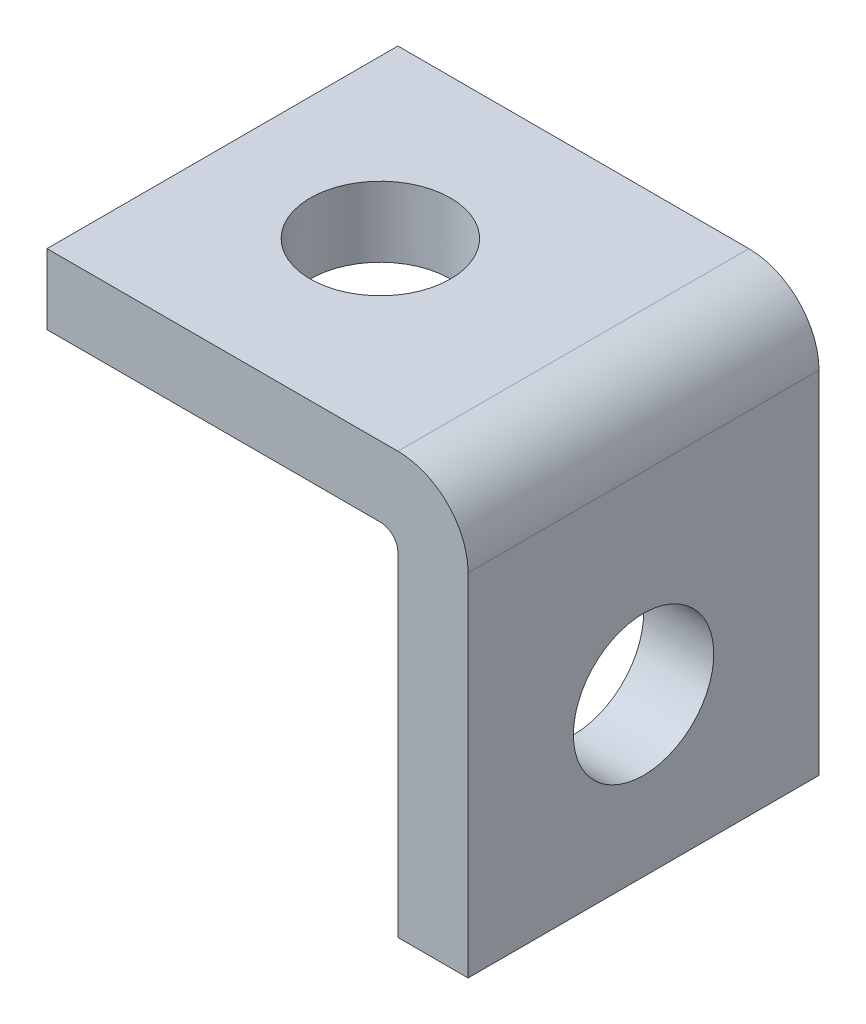
ISO-10303-21;
HEADER;
FILE_DESCRIPTION(('STEP AP214'),'2;1');
FILE_NAME('part.step','',(''),(''),'','','');
FILE_SCHEMA(('AUTOMOTIVE_DESIGN { 1 0 10303 214 1 1 1 1 }'));
ENDSEC;
DATA;
#1=APPLICATION_CONTEXT('core data for automotive mechanical design processes');
#2=APPLICATION_PROTOCOL_DEFINITION('international standard','automotive_design',2000,#1);
#3=PRODUCT_CONTEXT('',#1,'mechanical');
#4=PRODUCT('Part','Part','',(#3));
#5=PRODUCT_RELATED_PRODUCT_CATEGORY('part','',(#4));
#6=PRODUCT_DEFINITION_FORMATION('','',#4);
#7=PRODUCT_DEFINITION_CONTEXT('part definition',#1,'design');
#8=PRODUCT_DEFINITION('design','',#6,#7);
#9=PRODUCT_DEFINITION_SHAPE('','',#8);
#10=(LENGTH_UNIT() NAMED_UNIT(*) SI_UNIT(.MILLI.,.METRE.));
#11=(NAMED_UNIT(*) PLANE_ANGLE_UNIT() SI_UNIT($,.RADIAN.));
#12=(NAMED_UNIT(*) SI_UNIT($,.STERADIAN.) SOLID_ANGLE_UNIT());
#13=UNCERTAINTY_MEASURE_WITH_UNIT(LENGTH_MEASURE(1.E-05),#10,'distance_accuracy_value','');
#14=(GEOMETRIC_REPRESENTATION_CONTEXT(3) GLOBAL_UNCERTAINTY_ASSIGNED_CONTEXT((#13)) GLOBAL_UNIT_ASSIGNED_CONTEXT((#10,
#11,#12)) REPRESENTATION_CONTEXT('',''));
#15=CARTESIAN_POINT('',(0.,0.,0.));
#16=DIRECTION('',(0.,0.,1.));
#17=DIRECTION('',(1.,0.,0.));
#18=AXIS2_PLACEMENT_3D('',#15,#16,#17);
#19=CARTESIAN_POINT('',(0.,10.,10.));
#20=DIRECTION('',(1.,0.,0.));
#21=DIRECTION('',(0.,0.,-1.));
#22=AXIS2_PLACEMENT_3D('',#19,#20,#21);
#23=PLANE('',#22);
#24=DIRECTION('',(0.,-1.,0.));
#25=VECTOR('',#24,1.);
#26=CARTESIAN_POINT('',(0.,10.,0.));
#27=LINE('',#26,#25);
#28=CARTESIAN_POINT('',(0.,12.,0.));
#29=VERTEX_POINT('',#28);
#30=CARTESIAN_POINT('',(0.,10.,0.));
#31=VERTEX_POINT('',#30);
#32=EDGE_CURVE('E116',#29,#31,#27,.T.);
#33=ORIENTED_EDGE('',*,*,#32,.T.);
#34=DIRECTION('',(0.,0.,-1.));
#35=VECTOR('',#34,1.);
#36=CARTESIAN_POINT('',(0.,10.,10.));
#37=LINE('',#36,#35);
#38=CARTESIAN_POINT('',(0.,10.,10.));
#39=VERTEX_POINT('',#38);
#40=EDGE_CURVE('E98',#39,#31,#37,.T.);
#41=ORIENTED_EDGE('',*,*,#40,.F.);
#42=DIRECTION('',(0.,-1.,0.));
#43=VECTOR('',#42,1.);
#44=CARTESIAN_POINT('',(0.,10.,10.));
#45=LINE('',#44,#43);
#46=CARTESIAN_POINT('',(0.,12.,10.));
#47=VERTEX_POINT('',#46);
#48=EDGE_CURVE('E103',#47,#39,#45,.T.);
#49=ORIENTED_EDGE('',*,*,#48,.F.);
#50=DIRECTION('',(0.,0.,-1.));
#51=VECTOR('',#50,1.);
#52=CARTESIAN_POINT('',(0.,12.,10.));
#53=LINE('',#52,#51);
#54=EDGE_CURVE('E158',#47,#29,#53,.T.);
#55=ORIENTED_EDGE('',*,*,#54,.T.);
#56=EDGE_LOOP('',(#33,#41,#49,#55));
#57=FACE_BOUND('',#56,.T.);
#58=ADVANCED_FACE('F33',(#57),#23,.F.);
#59=CARTESIAN_POINT('',(9.99999999999999,10.,10.));
#60=DIRECTION('',(0.,1.,0.));
#61=DIRECTION('',(-1.,0.,0.));
#62=AXIS2_PLACEMENT_3D('',#59,#60,#61);
#63=PLANE('',#62);
#64=CARTESIAN_POINT('',(4.5,10.,5.));
#65=DIRECTION('',(0.,-1.,0.));
#66=DIRECTION('',(1.,0.,0.));
#67=AXIS2_PLACEMENT_3D('',#64,#65,#66);
#68=CIRCLE('',#67,2.);
#69=CARTESIAN_POINT('',(6.5,10.,5.));
#70=VERTEX_POINT('',#69);
#71=EDGE_CURVE('E234',#70,#70,#68,.T.);
#72=ORIENTED_EDGE('',*,*,#71,.F.);
#73=EDGE_LOOP('',(#72));
#74=FACE_BOUND('',#73,.T.);
#75=DIRECTION('',(1.,0.,0.));
#76=VECTOR('',#75,1.);
#77=CARTESIAN_POINT('',(9.99999999999999,10.,0.));
#78=LINE('',#77,#76);
#79=CARTESIAN_POINT('',(9.49999999999999,10.,0.));
#80=VERTEX_POINT('',#79);
#81=EDGE_CURVE('E148',#31,#80,#78,.T.);
#82=ORIENTED_EDGE('',*,*,#81,.T.);
#83=DIRECTION('',(0.,0.,-1.));
#84=VECTOR('',#83,1.);
#85=CARTESIAN_POINT('',(9.49999999999999,10.,10.));
#86=LINE('',#85,#84);
#87=CARTESIAN_POINT('',(9.49999999999999,10.,10.));
#88=VERTEX_POINT('',#87);
#89=EDGE_CURVE('E48',#80,#88,#86,.F.);
#90=ORIENTED_EDGE('',*,*,#89,.T.);
#91=DIRECTION('',(1.,0.,0.));
#92=VECTOR('',#91,1.);
#93=CARTESIAN_POINT('',(9.99999999999999,10.,10.));
#94=LINE('',#93,#92);
#95=EDGE_CURVE('E94',#39,#88,#94,.T.);
#96=ORIENTED_EDGE('',*,*,#95,.F.);
#97=ORIENTED_EDGE('',*,*,#40,.T.);
#98=EDGE_LOOP('',(#82,#90,#96,#97));
#99=FACE_BOUND('',#98,.T.);
#100=ADVANCED_FACE('F96',(#74,#99),#63,.F.);
#101=CARTESIAN_POINT('',(10.,0.,10.));
#102=DIRECTION('',(1.,0.,0.));
#103=DIRECTION('',(0.,1.,0.));
#104=AXIS2_PLACEMENT_3D('',#101,#102,#103);
#105=PLANE('',#104);
#106=CARTESIAN_POINT('',(10.,4.5,5.));
#107=DIRECTION('',(-1.,0.,0.));
#108=DIRECTION('',(0.,-1.,0.));
#109=AXIS2_PLACEMENT_3D('',#106,#107,#108);
#110=CIRCLE('',#109,2.);
#111=CARTESIAN_POINT('',(10.,2.5,5.));
#112=VERTEX_POINT('',#111);
#113=EDGE_CURVE('E180',#112,#112,#110,.T.);
#114=ORIENTED_EDGE('',*,*,#113,.F.);
#115=EDGE_LOOP('',(#114));
#116=FACE_BOUND('',#115,.T.);
#117=DIRECTION('',(0.,-1.,0.));
#118=VECTOR('',#117,1.);
#119=CARTESIAN_POINT('',(10.,0.,10.));
#120=LINE('',#119,#118);
#121=CARTESIAN_POINT('',(9.99999999999999,9.5,10.));
#122=VERTEX_POINT('',#121);
#123=CARTESIAN_POINT('',(10.,0.,10.));
#124=VERTEX_POINT('',#123);
#125=EDGE_CURVE('E102',#122,#124,#120,.T.);
#126=ORIENTED_EDGE('',*,*,#125,.F.);
#127=DIRECTION('',(0.,0.,-1.));
#128=VECTOR('',#127,1.);
#129=CARTESIAN_POINT('',(9.99999999999999,9.5,0.));
#130=LINE('',#129,#128);
#131=CARTESIAN_POINT('',(9.99999999999999,9.5,0.));
#132=VERTEX_POINT('',#131);
#133=EDGE_CURVE('E133',#122,#132,#130,.T.);
#134=ORIENTED_EDGE('',*,*,#133,.T.);
#135=DIRECTION('',(0.,-1.,0.));
#136=VECTOR('',#135,1.);
#137=CARTESIAN_POINT('',(10.,0.,0.));
#138=LINE('',#137,#136);
#139=CARTESIAN_POINT('',(10.,0.,0.));
#140=VERTEX_POINT('',#139);
#141=EDGE_CURVE('E141',#132,#140,#138,.T.);
#142=ORIENTED_EDGE('',*,*,#141,.T.);
#143=DIRECTION('',(0.,0.,-1.));
#144=VECTOR('',#143,1.);
#145=CARTESIAN_POINT('',(10.,0.,10.));
#146=LINE('',#145,#144);
#147=EDGE_CURVE('E118',#124,#140,#146,.T.);
#148=ORIENTED_EDGE('',*,*,#147,.F.);
#149=EDGE_LOOP('',(#126,#134,#142,#148));
#150=FACE_BOUND('',#149,.T.);
#151=ADVANCED_FACE('F139',(#116,#150),#105,.F.);
#152=CARTESIAN_POINT('',(12.,0.,10.));
#153=DIRECTION('',(0.,1.,0.));
#154=DIRECTION('',(-1.,0.,0.));
#155=AXIS2_PLACEMENT_3D('',#152,#153,#154);
#156=PLANE('',#155);
#157=DIRECTION('',(1.,0.,0.));
#158=VECTOR('',#157,1.);
#159=CARTESIAN_POINT('',(12.,0.,0.));
#160=LINE('',#159,#158);
#161=CARTESIAN_POINT('',(12.,0.,0.));
#162=VERTEX_POINT('',#161);
#163=EDGE_CURVE('E147',#140,#162,#160,.T.);
#164=ORIENTED_EDGE('',*,*,#163,.T.);
#165=DIRECTION('',(0.,0.,-1.));
#166=VECTOR('',#165,1.);
#167=CARTESIAN_POINT('',(12.,0.,10.));
#168=LINE('',#167,#166);
#169=CARTESIAN_POINT('',(12.,0.,10.));
#170=VERTEX_POINT('',#169);
#171=EDGE_CURVE('E124',#170,#162,#168,.T.);
#172=ORIENTED_EDGE('',*,*,#171,.F.);
#173=DIRECTION('',(1.,0.,0.));
#174=VECTOR('',#173,1.);
#175=CARTESIAN_POINT('',(12.,0.,10.));
#176=LINE('',#175,#174);
#177=EDGE_CURVE('E175',#124,#170,#176,.T.);
#178=ORIENTED_EDGE('',*,*,#177,.F.);
#179=ORIENTED_EDGE('',*,*,#147,.T.);
#180=EDGE_LOOP('',(#164,#172,#178,#179));
#181=FACE_BOUND('',#180,.T.);
#182=ADVANCED_FACE('F189',(#181),#156,.F.);
#183=CARTESIAN_POINT('',(12.,12.,10.));
#184=DIRECTION('',(-1.,0.,0.));
#185=DIRECTION('',(0.,0.,1.));
#186=AXIS2_PLACEMENT_3D('',#183,#184,#185);
#187=PLANE('',#186);
#188=CARTESIAN_POINT('',(12.,4.5,5.));
#189=DIRECTION('',(-1.,0.,0.));
#190=DIRECTION('',(0.,0.,1.));
#191=AXIS2_PLACEMENT_3D('',#188,#189,#190);
#192=CIRCLE('',#191,2.);
#193=CARTESIAN_POINT('',(12.,4.5,7.));
#194=VERTEX_POINT('',#193);
#195=EDGE_CURVE('E178',#194,#194,#192,.F.);
#196=ORIENTED_EDGE('',*,*,#195,.F.);
#197=EDGE_LOOP('',(#196));
#198=FACE_BOUND('',#197,.T.);
#199=DIRECTION('',(0.,1.,0.));
#200=VECTOR('',#199,1.);
#201=CARTESIAN_POINT('',(12.,12.,0.));
#202=LINE('',#201,#200);
#203=CARTESIAN_POINT('',(12.,10.,0.));
#204=VERTEX_POINT('',#203);
#205=EDGE_CURVE('E150',#162,#204,#202,.T.);
#206=ORIENTED_EDGE('',*,*,#205,.T.);
#207=DIRECTION('',(0.,0.,-1.));
#208=VECTOR('',#207,1.);
#209=CARTESIAN_POINT('',(12.,10.,10.));
#210=LINE('',#209,#208);
#211=CARTESIAN_POINT('',(12.,10.,10.));
#212=VERTEX_POINT('',#211);
#213=EDGE_CURVE('E129',#204,#212,#210,.F.);
#214=ORIENTED_EDGE('',*,*,#213,.T.);
#215=DIRECTION('',(0.,1.,0.));
#216=VECTOR('',#215,1.);
#217=CARTESIAN_POINT('',(12.,12.,10.));
#218=LINE('',#217,#216);
#219=EDGE_CURVE('E165',#170,#212,#218,.T.);
#220=ORIENTED_EDGE('',*,*,#219,.F.);
#221=ORIENTED_EDGE('',*,*,#171,.T.);
#222=EDGE_LOOP('',(#206,#214,#220,#221));
#223=FACE_BOUND('',#222,.T.);
#224=ADVANCED_FACE('F163',(#198,#223),#187,.F.);
#225=CARTESIAN_POINT('',(0.,12.,10.));
#226=DIRECTION('',(0.,-1.,0.));
#227=DIRECTION('',(0.,0.,-1.));
#228=AXIS2_PLACEMENT_3D('',#225,#226,#227);
#229=PLANE('',#228);
#230=CARTESIAN_POINT('',(4.5,12.,5.));
#231=DIRECTION('',(0.,-1.,0.));
#232=DIRECTION('',(0.,0.,-1.));
#233=AXIS2_PLACEMENT_3D('',#230,#231,#232);
#234=CIRCLE('',#233,2.);
#235=CARTESIAN_POINT('',(4.5,12.,3.));
#236=VERTEX_POINT('',#235);
#237=EDGE_CURVE('E185',#236,#236,#234,.F.);
#238=ORIENTED_EDGE('',*,*,#237,.F.);
#239=EDGE_LOOP('',(#238));
#240=FACE_BOUND('',#239,.T.);
#241=DIRECTION('',(-1.,0.,0.));
#242=VECTOR('',#241,1.);
#243=CARTESIAN_POINT('',(0.,12.,10.));
#244=LINE('',#243,#242);
#245=CARTESIAN_POINT('',(10.,12.,10.));
#246=VERTEX_POINT('',#245);
#247=EDGE_CURVE('E109',#246,#47,#244,.T.);
#248=ORIENTED_EDGE('',*,*,#247,.F.);
#249=DIRECTION('',(0.,0.,-1.));
#250=VECTOR('',#249,1.);
#251=CARTESIAN_POINT('',(10.,12.,10.));
#252=LINE('',#251,#250);
#253=CARTESIAN_POINT('',(10.,12.,0.));
#254=VERTEX_POINT('',#253);
#255=EDGE_CURVE('E117',#246,#254,#252,.T.);
#256=ORIENTED_EDGE('',*,*,#255,.T.);
#257=DIRECTION('',(-1.,0.,0.));
#258=VECTOR('',#257,1.);
#259=CARTESIAN_POINT('',(0.,12.,0.));
#260=LINE('',#259,#258);
#261=EDGE_CURVE('E113',#254,#29,#260,.T.);
#262=ORIENTED_EDGE('',*,*,#261,.T.);
#263=ORIENTED_EDGE('',*,*,#54,.F.);
#264=EDGE_LOOP('',(#248,#256,#262,#263));
#265=FACE_BOUND('',#264,.T.);
#266=ADVANCED_FACE('F173',(#240,#265),#229,.F.);
#267=CARTESIAN_POINT('',(0.,0.,10.));
#268=DIRECTION('',(0.,0.,-1.));
#269=DIRECTION('',(-1.,0.,0.));
#270=AXIS2_PLACEMENT_3D('',#267,#268,#269);
#271=PLANE('',#270);
#272=ORIENTED_EDGE('',*,*,#219,.T.);
#273=CARTESIAN_POINT('',(10.,10.,10.));
#274=DIRECTION('',(0.,0.,-1.));
#275=DIRECTION('',(-1.,0.,0.));
#276=AXIS2_PLACEMENT_3D('',#273,#274,#275);
#277=CIRCLE('',#276,2.);
#278=EDGE_CURVE('E131',#212,#246,#277,.F.);
#279=ORIENTED_EDGE('',*,*,#278,.T.);
#280=ORIENTED_EDGE('',*,*,#247,.T.);
#281=ORIENTED_EDGE('',*,*,#48,.T.);
#282=ORIENTED_EDGE('',*,*,#95,.T.);
#283=CARTESIAN_POINT('',(9.49999999999999,9.5,10.));
#284=DIRECTION('',(0.,0.,-1.));
#285=DIRECTION('',(-1.,0.,0.));
#286=AXIS2_PLACEMENT_3D('',#283,#284,#285);
#287=CIRCLE('',#286,0.5);
#288=EDGE_CURVE('E11',#88,#122,#287,.T.);
#289=ORIENTED_EDGE('',*,*,#288,.T.);
#290=ORIENTED_EDGE('',*,*,#125,.T.);
#291=ORIENTED_EDGE('',*,*,#177,.T.);
#292=EDGE_LOOP('',(#272,#279,#280,#281,#282,#289,#290,#291));
#293=FACE_BOUND('',#292,.T.);
#294=ADVANCED_FACE('F107',(#293),#271,.F.);
#295=CARTESIAN_POINT('',(0.,0.,0.));
#296=DIRECTION('',(0.,0.,-1.));
#297=DIRECTION('',(-1.,0.,0.));
#298=AXIS2_PLACEMENT_3D('',#295,#296,#297);
#299=PLANE('',#298);
#300=ORIENTED_EDGE('',*,*,#261,.F.);
#301=CARTESIAN_POINT('',(10.,10.,0.));
#302=DIRECTION('',(0.,0.,-1.));
#303=DIRECTION('',(-1.,0.,0.));
#304=AXIS2_PLACEMENT_3D('',#301,#302,#303);
#305=CIRCLE('',#304,2.);
#306=EDGE_CURVE('E121',#254,#204,#305,.T.);
#307=ORIENTED_EDGE('',*,*,#306,.T.);
#308=ORIENTED_EDGE('',*,*,#205,.F.);
#309=ORIENTED_EDGE('',*,*,#163,.F.);
#310=ORIENTED_EDGE('',*,*,#141,.F.);
#311=CARTESIAN_POINT('',(9.49999999999999,9.5,0.));
#312=DIRECTION('',(0.,0.,-1.));
#313=DIRECTION('',(-1.,0.,0.));
#314=AXIS2_PLACEMENT_3D('',#311,#312,#313);
#315=CIRCLE('',#314,0.5);
#316=EDGE_CURVE('E41',#132,#80,#315,.F.);
#317=ORIENTED_EDGE('',*,*,#316,.T.);
#318=ORIENTED_EDGE('',*,*,#81,.F.);
#319=ORIENTED_EDGE('',*,*,#32,.F.);
#320=EDGE_LOOP('',(#300,#307,#308,#309,#310,#317,#318,#319));
#321=FACE_BOUND('',#320,.T.);
#322=ADVANCED_FACE('F145',(#321),#299,.T.);
#323=CARTESIAN_POINT('',(12.001,4.5,5.));
#324=DIRECTION('',(-1.,0.,0.));
#325=DIRECTION('',(0.,-1.,0.));
#326=AXIS2_PLACEMENT_3D('',#323,#324,#325);
#327=CYLINDRICAL_SURFACE('',#326,2.);
#328=ORIENTED_EDGE('',*,*,#113,.T.);
#329=EDGE_LOOP('',(#328));
#330=FACE_BOUND('',#329,.T.);
#331=ORIENTED_EDGE('',*,*,#195,.T.);
#332=EDGE_LOOP('',(#331));
#333=FACE_BOUND('',#332,.T.);
#334=ADVANCED_FACE('F213',(#330,#333),#327,.F.);
#335=CARTESIAN_POINT('',(4.5,12.001,5.));
#336=DIRECTION('',(0.,-1.,0.));
#337=DIRECTION('',(1.,0.,0.));
#338=AXIS2_PLACEMENT_3D('',#335,#336,#337);
#339=CYLINDRICAL_SURFACE('',#338,2.);
#340=ORIENTED_EDGE('',*,*,#71,.T.);
#341=EDGE_LOOP('',(#340));
#342=FACE_BOUND('',#341,.T.);
#343=ORIENTED_EDGE('',*,*,#237,.T.);
#344=EDGE_LOOP('',(#343));
#345=FACE_BOUND('',#344,.T.);
#346=ADVANCED_FACE('F208',(#342,#345),#339,.F.);
#347=CARTESIAN_POINT('',(10.,10.,10.));
#348=DIRECTION('',(0.,0.,-1.));
#349=DIRECTION('',(-1.,0.,0.));
#350=AXIS2_PLACEMENT_3D('',#347,#348,#349);
#351=CYLINDRICAL_SURFACE('',#350,2.);
#352=ORIENTED_EDGE('',*,*,#278,.F.);
#353=ORIENTED_EDGE('',*,*,#213,.F.);
#354=ORIENTED_EDGE('',*,*,#306,.F.);
#355=ORIENTED_EDGE('',*,*,#255,.F.);
#356=EDGE_LOOP('',(#352,#353,#354,#355));
#357=FACE_BOUND('',#356,.T.);
#358=ADVANCED_FACE('F171',(#357),#351,.T.);
#359=CARTESIAN_POINT('',(9.49999999999999,9.5,10.));
#360=DIRECTION('',(0.,0.,1.));
#361=DIRECTION('',(1.,0.,0.));
#362=AXIS2_PLACEMENT_3D('',#359,#360,#361);
#363=CYLINDRICAL_SURFACE('',#362,0.5);
#364=ORIENTED_EDGE('',*,*,#288,.F.);
#365=ORIENTED_EDGE('',*,*,#89,.F.);
#366=ORIENTED_EDGE('',*,*,#316,.F.);
#367=ORIENTED_EDGE('',*,*,#133,.F.);
#368=EDGE_LOOP('',(#364,#365,#366,#367));
#369=FACE_BOUND('',#368,.T.);
#370=ADVANCED_FACE('F35',(#369),#363,.F.);
#371=CLOSED_SHELL('',(#58,#100,#151,#182,#224,#266,#294,#322,#334,#346,#358,#370));
#372=MANIFOLD_SOLID_BREP('B2',#371);
#373=ADVANCED_BREP_SHAPE_REPRESENTATION('',(#18,#372),#14);
#374=SHAPE_DEFINITION_REPRESENTATION(#9,#373);
ENDSEC;
END-ISO-10303-21;
